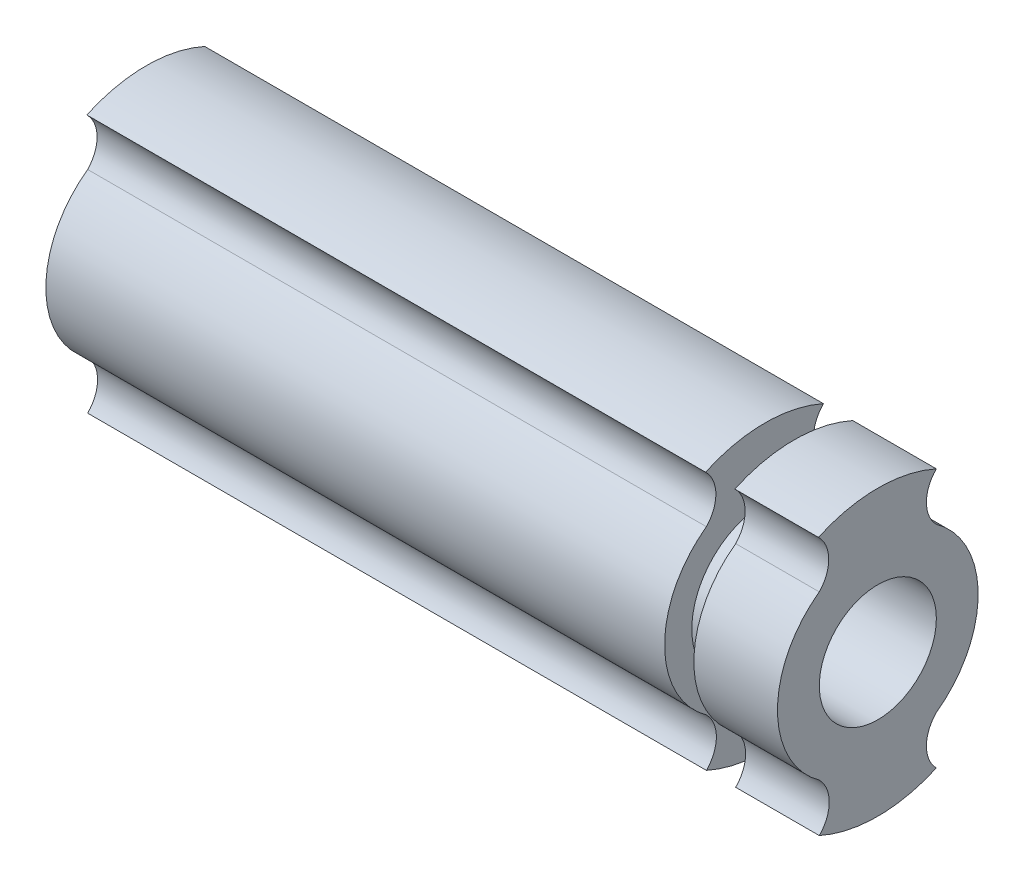
ISO-10303-21;
HEADER;
FILE_DESCRIPTION(('STEP AP214'),'2;1');
FILE_NAME('part.step','',(''),(''),'','','');
FILE_SCHEMA(('AUTOMOTIVE_DESIGN { 1 0 10303 214 1 1 1 1 }'));
ENDSEC;
DATA;
#1=APPLICATION_CONTEXT('core data for automotive mechanical design processes');
#2=APPLICATION_PROTOCOL_DEFINITION('international standard','automotive_design',2000,#1);
#3=PRODUCT_CONTEXT('',#1,'mechanical');
#4=PRODUCT('Part','Part','',(#3));
#5=PRODUCT_RELATED_PRODUCT_CATEGORY('part','',(#4));
#6=PRODUCT_DEFINITION_FORMATION('','',#4);
#7=PRODUCT_DEFINITION_CONTEXT('part definition',#1,'design');
#8=PRODUCT_DEFINITION('design','',#6,#7);
#9=PRODUCT_DEFINITION_SHAPE('','',#8);
#10=(LENGTH_UNIT() NAMED_UNIT(*) SI_UNIT(.MILLI.,.METRE.));
#11=(NAMED_UNIT(*) PLANE_ANGLE_UNIT() SI_UNIT($,.RADIAN.));
#12=(NAMED_UNIT(*) SI_UNIT($,.STERADIAN.) SOLID_ANGLE_UNIT());
#13=UNCERTAINTY_MEASURE_WITH_UNIT(LENGTH_MEASURE(1.E-05),#10,'distance_accuracy_value','');
#14=(GEOMETRIC_REPRESENTATION_CONTEXT(3) GLOBAL_UNCERTAINTY_ASSIGNED_CONTEXT((#13)) GLOBAL_UNIT_ASSIGNED_CONTEXT((#10,
#11,#12)) REPRESENTATION_CONTEXT('',''));
#15=CARTESIAN_POINT('',(0.,0.,0.));
#16=DIRECTION('',(0.,0.,1.));
#17=DIRECTION('',(1.,0.,0.));
#18=AXIS2_PLACEMENT_3D('',#15,#16,#17);
#19=CARTESIAN_POINT('',(175.,0.,0.));
#20=DIRECTION('',(-1.,0.,0.));
#21=DIRECTION('',(0.,0.,1.));
#22=AXIS2_PLACEMENT_3D('',#19,#20,#21);
#23=CYLINDRICAL_SURFACE('',#22,24.);
#24=DIRECTION('',(-1.,0.,0.));
#25=VECTOR('',#24,1.);
#26=CARTESIAN_POINT('',(175.,19.4935886896179,-14.));
#27=LINE('',#26,#25);
#28=CARTESIAN_POINT('',(148.,19.4935886896179,-14.));
#29=VERTEX_POINT('',#28);
#30=CARTESIAN_POINT('',(0.,19.4935886896179,-14.));
#31=VERTEX_POINT('',#30);
#32=EDGE_CURVE('E192',#29,#31,#27,.T.);
#33=ORIENTED_EDGE('',*,*,#32,.F.);
#34=CARTESIAN_POINT('',(148.,0.,0.));
#35=DIRECTION('',(-1.,0.,0.));
#36=DIRECTION('',(0.,0.,1.));
#37=AXIS2_PLACEMENT_3D('',#34,#35,#36);
#38=CIRCLE('',#37,24.);
#39=CARTESIAN_POINT('',(148.,-19.4935886896179,-14.));
#40=VERTEX_POINT('',#39);
#41=EDGE_CURVE('E289',#29,#40,#38,.T.);
#42=ORIENTED_EDGE('',*,*,#41,.T.);
#43=DIRECTION('',(-1.,0.,0.));
#44=VECTOR('',#43,1.);
#45=CARTESIAN_POINT('',(175.,-19.4935886896179,-14.));
#46=LINE('',#45,#44);
#47=CARTESIAN_POINT('',(0.,-19.4935886896179,-14.));
#48=VERTEX_POINT('',#47);
#49=EDGE_CURVE('E221',#40,#48,#46,.T.);
#50=ORIENTED_EDGE('',*,*,#49,.T.);
#51=CARTESIAN_POINT('',(0.,0.,0.));
#52=DIRECTION('',(1.,0.,0.));
#53=DIRECTION('',(0.,0.,-1.));
#54=AXIS2_PLACEMENT_3D('',#51,#52,#53);
#55=CIRCLE('',#54,24.);
#56=EDGE_CURVE('E217',#48,#31,#55,.T.);
#57=ORIENTED_EDGE('',*,*,#56,.T.);
#58=EDGE_LOOP('',(#33,#42,#50,#57));
#59=FACE_BOUND('',#58,.T.);
#60=ADVANCED_FACE('F39',(#59),#23,.T.);
#61=CARTESIAN_POINT('',(175.,25.2387277296386,-19.7451390400207));
#62=DIRECTION('',(-1.,0.,0.));
#63=DIRECTION('',(0.,0.,1.));
#64=AXIS2_PLACEMENT_3D('',#61,#62,#63);
#65=CYLINDRICAL_SURFACE('',#64,8.12485354811642);
#66=DIRECTION('',(-1.,0.,0.));
#67=VECTOR('',#66,1.);
#68=CARTESIAN_POINT('',(175.,30.9838667696593,-14.));
#69=LINE('',#68,#67);
#70=CARTESIAN_POINT('',(148.,30.9838667696593,-14.));
#71=VERTEX_POINT('',#70);
#72=CARTESIAN_POINT('',(0.,30.9838667696593,-14.));
#73=VERTEX_POINT('',#72);
#74=EDGE_CURVE('E194',#71,#73,#69,.T.);
#75=ORIENTED_EDGE('',*,*,#74,.F.);
#76=CARTESIAN_POINT('',(148.,25.2387277296386,-19.7451390400207));
#77=DIRECTION('',(-1.,0.,0.));
#78=DIRECTION('',(0.,0.,1.));
#79=AXIS2_PLACEMENT_3D('',#76,#77,#78);
#80=CIRCLE('',#79,8.12485354811642);
#81=EDGE_CURVE('E207',#71,#29,#80,.F.);
#82=ORIENTED_EDGE('',*,*,#81,.T.);
#83=ORIENTED_EDGE('',*,*,#32,.T.);
#84=CARTESIAN_POINT('',(0.,25.2387277296386,-19.7451390400207));
#85=DIRECTION('',(-1.,0.,0.));
#86=DIRECTION('',(0.,0.,1.));
#87=AXIS2_PLACEMENT_3D('',#84,#85,#86);
#88=CIRCLE('',#87,8.12485354811642);
#89=EDGE_CURVE('E210',#31,#73,#88,.T.);
#90=ORIENTED_EDGE('',*,*,#89,.T.);
#91=EDGE_LOOP('',(#75,#82,#83,#90));
#92=FACE_BOUND('',#91,.T.);
#93=ADVANCED_FACE('F206',(#92),#65,.F.);
#94=CARTESIAN_POINT('',(175.,0.,0.));
#95=DIRECTION('',(-1.,0.,0.));
#96=DIRECTION('',(0.,0.,1.));
#97=AXIS2_PLACEMENT_3D('',#94,#95,#96);
#98=CYLINDRICAL_SURFACE('',#97,34.);
#99=DIRECTION('',(-1.,0.,0.));
#100=VECTOR('',#99,1.);
#101=CARTESIAN_POINT('',(175.,30.8916689330158,14.2022811735632));
#102=LINE('',#101,#100);
#103=CARTESIAN_POINT('',(148.,30.8916689330158,14.2022811735632));
#104=VERTEX_POINT('',#103);
#105=CARTESIAN_POINT('',(0.,30.8916689330158,14.2022811735632));
#106=VERTEX_POINT('',#105);
#107=EDGE_CURVE('E186',#104,#106,#102,.T.);
#108=ORIENTED_EDGE('',*,*,#107,.F.);
#109=CARTESIAN_POINT('',(148.,0.,0.));
#110=DIRECTION('',(-1.,0.,0.));
#111=DIRECTION('',(0.,0.,1.));
#112=AXIS2_PLACEMENT_3D('',#109,#110,#111);
#113=CIRCLE('',#112,34.);
#114=EDGE_CURVE('E281',#104,#71,#113,.T.);
#115=ORIENTED_EDGE('',*,*,#114,.T.);
#116=ORIENTED_EDGE('',*,*,#74,.T.);
#117=CARTESIAN_POINT('',(0.,0.,0.));
#118=DIRECTION('',(1.,0.,0.));
#119=DIRECTION('',(0.,0.,-1.));
#120=AXIS2_PLACEMENT_3D('',#117,#118,#119);
#121=CIRCLE('',#120,34.);
#122=EDGE_CURVE('E222',#73,#106,#121,.T.);
#123=ORIENTED_EDGE('',*,*,#122,.T.);
#124=EDGE_LOOP('',(#108,#115,#116,#123));
#125=FACE_BOUND('',#124,.T.);
#126=ADVANCED_FACE('F310',(#125),#98,.T.);
#127=CARTESIAN_POINT('',(175.,25.0914882245353,19.8001807084806));
#128=DIRECTION('',(-1.,0.,0.));
#129=DIRECTION('',(0.,0.,1.));
#130=AXIS2_PLACEMENT_3D('',#127,#128,#129);
#131=CYLINDRICAL_SURFACE('',#130,8.0609289448585);
#132=DIRECTION('',(-1.,0.,0.));
#133=VECTOR('',#132,1.);
#134=CARTESIAN_POINT('',(175.,19.4935886896179,14.));
#135=LINE('',#134,#133);
#136=CARTESIAN_POINT('',(148.,19.4935886896179,14.));
#137=VERTEX_POINT('',#136);
#138=CARTESIAN_POINT('',(0.,19.4935886896179,14.));
#139=VERTEX_POINT('',#138);
#140=EDGE_CURVE('E181',#137,#139,#135,.T.);
#141=ORIENTED_EDGE('',*,*,#140,.F.);
#142=CARTESIAN_POINT('',(148.,25.0914882245353,19.8001807084806));
#143=DIRECTION('',(-1.,0.,0.));
#144=DIRECTION('',(0.,0.,1.));
#145=AXIS2_PLACEMENT_3D('',#142,#143,#144);
#146=CIRCLE('',#145,8.0609289448585);
#147=EDGE_CURVE('E276',#137,#104,#146,.F.);
#148=ORIENTED_EDGE('',*,*,#147,.T.);
#149=ORIENTED_EDGE('',*,*,#107,.T.);
#150=CARTESIAN_POINT('',(0.,25.0914882245353,19.8001807084806));
#151=DIRECTION('',(-1.,0.,0.));
#152=DIRECTION('',(0.,0.,-1.));
#153=AXIS2_PLACEMENT_3D('',#150,#151,#152);
#154=CIRCLE('',#153,8.0609289448585);
#155=EDGE_CURVE('E232',#106,#139,#154,.T.);
#156=ORIENTED_EDGE('',*,*,#155,.T.);
#157=EDGE_LOOP('',(#141,#148,#149,#156));
#158=FACE_BOUND('',#157,.T.);
#159=ADVANCED_FACE('F337',(#158),#131,.F.);
#160=CARTESIAN_POINT('',(175.,0.,0.));
#161=DIRECTION('',(-1.,0.,0.));
#162=DIRECTION('',(0.,0.,1.));
#163=AXIS2_PLACEMENT_3D('',#160,#161,#162);
#164=CYLINDRICAL_SURFACE('',#163,24.);
#165=DIRECTION('',(-1.,0.,0.));
#166=VECTOR('',#165,1.);
#167=CARTESIAN_POINT('',(175.,-19.4935886896179,14.));
#168=LINE('',#167,#166);
#169=CARTESIAN_POINT('',(148.,-19.4935886896179,14.));
#170=VERTEX_POINT('',#169);
#171=CARTESIAN_POINT('',(0.,-19.4935886896179,14.));
#172=VERTEX_POINT('',#171);
#173=EDGE_CURVE('E178',#170,#172,#168,.T.);
#174=ORIENTED_EDGE('',*,*,#173,.F.);
#175=CARTESIAN_POINT('',(148.,0.,0.));
#176=DIRECTION('',(-1.,0.,0.));
#177=DIRECTION('',(0.,0.,1.));
#178=AXIS2_PLACEMENT_3D('',#175,#176,#177);
#179=CIRCLE('',#178,24.);
#180=EDGE_CURVE('E277',#170,#137,#179,.T.);
#181=ORIENTED_EDGE('',*,*,#180,.T.);
#182=ORIENTED_EDGE('',*,*,#140,.T.);
#183=CARTESIAN_POINT('',(0.,0.,0.));
#184=DIRECTION('',(1.,0.,0.));
#185=DIRECTION('',(0.,0.,-1.));
#186=AXIS2_PLACEMENT_3D('',#183,#184,#185);
#187=CIRCLE('',#186,24.);
#188=EDGE_CURVE('E236',#139,#172,#187,.T.);
#189=ORIENTED_EDGE('',*,*,#188,.T.);
#190=EDGE_LOOP('',(#174,#181,#182,#189));
#191=FACE_BOUND('',#190,.T.);
#192=ADVANCED_FACE('F339',(#191),#164,.T.);
#193=CARTESIAN_POINT('',(175.,-25.2387277296386,19.7451390400207));
#194=DIRECTION('',(-1.,0.,0.));
#195=DIRECTION('',(0.,0.,1.));
#196=AXIS2_PLACEMENT_3D('',#193,#194,#195);
#197=CYLINDRICAL_SURFACE('',#196,8.12485354811643);
#198=DIRECTION('',(-1.,0.,0.));
#199=VECTOR('',#198,1.);
#200=CARTESIAN_POINT('',(175.,-30.9838667696593,14.));
#201=LINE('',#200,#199);
#202=CARTESIAN_POINT('',(148.,-30.9838667696593,14.));
#203=VERTEX_POINT('',#202);
#204=CARTESIAN_POINT('',(0.,-30.9838667696593,14.));
#205=VERTEX_POINT('',#204);
#206=EDGE_CURVE('E174',#203,#205,#201,.T.);
#207=ORIENTED_EDGE('',*,*,#206,.F.);
#208=CARTESIAN_POINT('',(148.,-25.2387277296386,19.7451390400207));
#209=DIRECTION('',(-1.,0.,0.));
#210=DIRECTION('',(0.,0.,1.));
#211=AXIS2_PLACEMENT_3D('',#208,#209,#210);
#212=CIRCLE('',#211,8.12485354811643);
#213=EDGE_CURVE('E268',#203,#170,#212,.F.);
#214=ORIENTED_EDGE('',*,*,#213,.T.);
#215=ORIENTED_EDGE('',*,*,#173,.T.);
#216=CARTESIAN_POINT('',(0.,-25.2387277296386,19.7451390400207));
#217=DIRECTION('',(-1.,0.,0.));
#218=DIRECTION('',(0.,0.,1.));
#219=AXIS2_PLACEMENT_3D('',#216,#217,#218);
#220=CIRCLE('',#219,8.12485354811643);
#221=EDGE_CURVE('E244',#172,#205,#220,.T.);
#222=ORIENTED_EDGE('',*,*,#221,.T.);
#223=EDGE_LOOP('',(#207,#214,#215,#222));
#224=FACE_BOUND('',#223,.T.);
#225=ADVANCED_FACE('F332',(#224),#197,.F.);
#226=CARTESIAN_POINT('',(175.,0.,0.));
#227=DIRECTION('',(-1.,0.,0.));
#228=DIRECTION('',(0.,0.,1.));
#229=AXIS2_PLACEMENT_3D('',#226,#227,#228);
#230=CYLINDRICAL_SURFACE('',#229,34.);
#231=DIRECTION('',(-1.,0.,0.));
#232=VECTOR('',#231,1.);
#233=CARTESIAN_POINT('',(175.,-30.9838667696593,-14.));
#234=LINE('',#233,#232);
#235=CARTESIAN_POINT('',(148.,-30.9838667696593,-14.));
#236=VERTEX_POINT('',#235);
#237=CARTESIAN_POINT('',(0.,-30.9838667696593,-14.));
#238=VERTEX_POINT('',#237);
#239=EDGE_CURVE('E171',#236,#238,#234,.T.);
#240=ORIENTED_EDGE('',*,*,#239,.F.);
#241=CARTESIAN_POINT('',(148.,0.,0.));
#242=DIRECTION('',(-1.,0.,0.));
#243=DIRECTION('',(0.,0.,1.));
#244=AXIS2_PLACEMENT_3D('',#241,#242,#243);
#245=CIRCLE('',#244,34.);
#246=EDGE_CURVE('E53',#236,#203,#245,.T.);
#247=ORIENTED_EDGE('',*,*,#246,.T.);
#248=ORIENTED_EDGE('',*,*,#206,.T.);
#249=CARTESIAN_POINT('',(0.,0.,0.));
#250=DIRECTION('',(1.,0.,0.));
#251=DIRECTION('',(0.,0.,-1.));
#252=AXIS2_PLACEMENT_3D('',#249,#250,#251);
#253=CIRCLE('',#252,34.);
#254=EDGE_CURVE('E243',#205,#238,#253,.T.);
#255=ORIENTED_EDGE('',*,*,#254,.T.);
#256=EDGE_LOOP('',(#240,#247,#248,#255));
#257=FACE_BOUND('',#256,.T.);
#258=ADVANCED_FACE('F326',(#257),#230,.T.);
#259=CARTESIAN_POINT('',(175.,-25.2387277296386,-19.7451390400207));
#260=DIRECTION('',(-1.,0.,0.));
#261=DIRECTION('',(0.,0.,1.));
#262=AXIS2_PLACEMENT_3D('',#259,#260,#261);
#263=CYLINDRICAL_SURFACE('',#262,8.12485354811642);
#264=ORIENTED_EDGE('',*,*,#49,.F.);
#265=CARTESIAN_POINT('',(148.,-25.2387277296386,-19.7451390400207));
#266=DIRECTION('',(-1.,0.,0.));
#267=DIRECTION('',(0.,0.,1.));
#268=AXIS2_PLACEMENT_3D('',#265,#266,#267);
#269=CIRCLE('',#268,8.12485354811642);
#270=EDGE_CURVE('E11',#40,#236,#269,.F.);
#271=ORIENTED_EDGE('',*,*,#270,.T.);
#272=ORIENTED_EDGE('',*,*,#239,.T.);
#273=CARTESIAN_POINT('',(0.,-25.2387277296386,-19.7451390400207));
#274=DIRECTION('',(-1.,0.,0.));
#275=DIRECTION('',(0.,0.,-1.));
#276=AXIS2_PLACEMENT_3D('',#273,#274,#275);
#277=CIRCLE('',#276,8.12485354811642);
#278=EDGE_CURVE('E249',#238,#48,#277,.T.);
#279=ORIENTED_EDGE('',*,*,#278,.T.);
#280=EDGE_LOOP('',(#264,#271,#272,#279));
#281=FACE_BOUND('',#280,.T.);
#282=ADVANCED_FACE('F303',(#281),#263,.F.);
#283=CARTESIAN_POINT('',(175.,12.6193638648193,-9.87256952001035));
#284=DIRECTION('',(1.,0.,0.));
#285=DIRECTION('',(0.,0.,-1.));
#286=AXIS2_PLACEMENT_3D('',#283,#284,#285);
#287=PLANE('',#286);
#288=CARTESIAN_POINT('',(175.,0.,0.));
#289=DIRECTION('',(1.,0.,0.));
#290=DIRECTION('',(0.,0.,-1.));
#291=AXIS2_PLACEMENT_3D('',#288,#289,#290);
#292=CIRCLE('',#291,24.);
#293=CARTESIAN_POINT('',(175.,-19.4935886896179,-14.));
#294=VERTEX_POINT('',#293);
#295=CARTESIAN_POINT('',(175.,19.4935886896179,-14.));
#296=VERTEX_POINT('',#295);
#297=EDGE_CURVE('E246',#294,#296,#292,.T.);
#298=ORIENTED_EDGE('',*,*,#297,.T.);
#299=CARTESIAN_POINT('',(175.,25.2387277296386,-19.7451390400207));
#300=DIRECTION('',(-1.,0.,0.));
#301=DIRECTION('',(0.,0.,1.));
#302=AXIS2_PLACEMENT_3D('',#299,#300,#301);
#303=CIRCLE('',#302,8.12485354811642);
#304=CARTESIAN_POINT('',(175.,30.9838667696593,-14.));
#305=VERTEX_POINT('',#304);
#306=EDGE_CURVE('E247',#296,#305,#303,.T.);
#307=ORIENTED_EDGE('',*,*,#306,.T.);
#308=CARTESIAN_POINT('',(175.,0.,0.));
#309=DIRECTION('',(1.,0.,0.));
#310=DIRECTION('',(0.,0.,-1.));
#311=AXIS2_PLACEMENT_3D('',#308,#309,#310);
#312=CIRCLE('',#311,34.);
#313=CARTESIAN_POINT('',(175.,30.8916689330158,14.2022811735632));
#314=VERTEX_POINT('',#313);
#315=EDGE_CURVE('E255',#305,#314,#312,.T.);
#316=ORIENTED_EDGE('',*,*,#315,.T.);
#317=CARTESIAN_POINT('',(175.,25.0914882245353,19.8001807084806));
#318=DIRECTION('',(-1.,0.,0.));
#319=DIRECTION('',(0.,0.,-1.));
#320=AXIS2_PLACEMENT_3D('',#317,#318,#319);
#321=CIRCLE('',#320,8.0609289448585);
#322=CARTESIAN_POINT('',(175.,19.4935886896179,14.));
#323=VERTEX_POINT('',#322);
#324=EDGE_CURVE('E259',#314,#323,#321,.T.);
#325=ORIENTED_EDGE('',*,*,#324,.T.);
#326=CARTESIAN_POINT('',(175.,0.,0.));
#327=DIRECTION('',(1.,0.,0.));
#328=DIRECTION('',(0.,0.,-1.));
#329=AXIS2_PLACEMENT_3D('',#326,#327,#328);
#330=CIRCLE('',#329,24.);
#331=CARTESIAN_POINT('',(175.,-19.4935886896179,14.));
#332=VERTEX_POINT('',#331);
#333=EDGE_CURVE('E261',#323,#332,#330,.T.);
#334=ORIENTED_EDGE('',*,*,#333,.T.);
#335=CARTESIAN_POINT('',(175.,-25.2387277296386,19.7451390400207));
#336=DIRECTION('',(-1.,0.,0.));
#337=DIRECTION('',(0.,0.,1.));
#338=AXIS2_PLACEMENT_3D('',#335,#336,#337);
#339=CIRCLE('',#338,8.12485354811643);
#340=CARTESIAN_POINT('',(175.,-30.9838667696593,14.));
#341=VERTEX_POINT('',#340);
#342=EDGE_CURVE('E263',#332,#341,#339,.T.);
#343=ORIENTED_EDGE('',*,*,#342,.T.);
#344=CARTESIAN_POINT('',(175.,0.,0.));
#345=DIRECTION('',(1.,0.,0.));
#346=DIRECTION('',(0.,0.,-1.));
#347=AXIS2_PLACEMENT_3D('',#344,#345,#346);
#348=CIRCLE('',#347,34.);
#349=CARTESIAN_POINT('',(175.,-30.9838667696593,-14.));
#350=VERTEX_POINT('',#349);
#351=EDGE_CURVE('E262',#341,#350,#348,.T.);
#352=ORIENTED_EDGE('',*,*,#351,.T.);
#353=CARTESIAN_POINT('',(175.,-25.2387277296386,-19.7451390400207));
#354=DIRECTION('',(-1.,0.,0.));
#355=DIRECTION('',(0.,0.,-1.));
#356=AXIS2_PLACEMENT_3D('',#353,#354,#355);
#357=CIRCLE('',#356,8.12485354811642);
#358=EDGE_CURVE('E168',#350,#294,#357,.T.);
#359=ORIENTED_EDGE('',*,*,#358,.T.);
#360=EDGE_LOOP('',(#298,#307,#316,#325,#334,#343,#352,#359));
#361=FACE_BOUND('',#360,.T.);
#362=CARTESIAN_POINT('',(175.,0.,0.));
#363=DIRECTION('',(1.,0.,0.));
#364=DIRECTION('',(0.,0.,-1.));
#365=AXIS2_PLACEMENT_3D('',#362,#363,#364);
#366=CIRCLE('',#365,14.);
#367=CARTESIAN_POINT('',(175.,0.,-14.));
#368=VERTEX_POINT('',#367);
#369=EDGE_CURVE('E229',#368,#368,#366,.T.);
#370=ORIENTED_EDGE('',*,*,#369,.F.);
#371=EDGE_LOOP('',(#370));
#372=FACE_BOUND('',#371,.T.);
#373=ADVANCED_FACE('F320',(#361,#372),#287,.T.);
#374=CARTESIAN_POINT('',(0.,12.6193638648193,-9.87256952001035));
#375=DIRECTION('',(1.,0.,0.));
#376=DIRECTION('',(0.,0.,-1.));
#377=AXIS2_PLACEMENT_3D('',#374,#375,#376);
#378=PLANE('',#377);
#379=ORIENTED_EDGE('',*,*,#56,.F.);
#380=ORIENTED_EDGE('',*,*,#278,.F.);
#381=ORIENTED_EDGE('',*,*,#254,.F.);
#382=ORIENTED_EDGE('',*,*,#221,.F.);
#383=ORIENTED_EDGE('',*,*,#188,.F.);
#384=ORIENTED_EDGE('',*,*,#155,.F.);
#385=ORIENTED_EDGE('',*,*,#122,.F.);
#386=ORIENTED_EDGE('',*,*,#89,.F.);
#387=EDGE_LOOP('',(#379,#380,#381,#382,#383,#384,#385,#386));
#388=FACE_BOUND('',#387,.T.);
#389=CARTESIAN_POINT('',(0.,0.,0.));
#390=DIRECTION('',(1.,0.,0.));
#391=DIRECTION('',(0.,0.,-1.));
#392=AXIS2_PLACEMENT_3D('',#389,#390,#391);
#393=CIRCLE('',#392,14.);
#394=CARTESIAN_POINT('',(0.,0.,-14.));
#395=VERTEX_POINT('',#394);
#396=EDGE_CURVE('E228',#395,#395,#393,.T.);
#397=ORIENTED_EDGE('',*,*,#396,.T.);
#398=EDGE_LOOP('',(#397));
#399=FACE_BOUND('',#398,.T.);
#400=ADVANCED_FACE('F214',(#388,#399),#378,.F.);
#401=CARTESIAN_POINT('',(155.,-19.4935886896179,-14.));
#402=VERTEX_POINT('',#401);
#403=EDGE_CURVE('E172',#294,#402,#46,.T.);
#404=ORIENTED_EDGE('',*,*,#403,.T.);
#405=CARTESIAN_POINT('',(155.,0.,0.));
#406=DIRECTION('',(1.,0.,0.));
#407=DIRECTION('',(0.,0.,-1.));
#408=AXIS2_PLACEMENT_3D('',#405,#406,#407);
#409=CIRCLE('',#408,24.);
#410=CARTESIAN_POINT('',(155.,19.4935886896179,-14.));
#411=VERTEX_POINT('',#410);
#412=EDGE_CURVE('E64',#402,#411,#409,.T.);
#413=ORIENTED_EDGE('',*,*,#412,.T.);
#414=EDGE_CURVE('E156',#296,#411,#27,.T.);
#415=ORIENTED_EDGE('',*,*,#414,.F.);
#416=ORIENTED_EDGE('',*,*,#297,.F.);
#417=EDGE_LOOP('',(#404,#413,#415,#416));
#418=FACE_BOUND('',#417,.T.);
#419=ADVANCED_FACE('F41',(#418),#23,.T.);
#420=ORIENTED_EDGE('',*,*,#414,.T.);
#421=CARTESIAN_POINT('',(155.,25.2387277296386,-19.7451390400207));
#422=DIRECTION('',(1.,0.,0.));
#423=DIRECTION('',(0.,0.,-1.));
#424=AXIS2_PLACEMENT_3D('',#421,#422,#423);
#425=CIRCLE('',#424,8.12485354811642);
#426=CARTESIAN_POINT('',(155.,30.9838667696593,-14.));
#427=VERTEX_POINT('',#426);
#428=EDGE_CURVE('E266',#411,#427,#425,.F.);
#429=ORIENTED_EDGE('',*,*,#428,.T.);
#430=EDGE_CURVE('E191',#305,#427,#69,.T.);
#431=ORIENTED_EDGE('',*,*,#430,.F.);
#432=ORIENTED_EDGE('',*,*,#306,.F.);
#433=EDGE_LOOP('',(#420,#429,#431,#432));
#434=FACE_BOUND('',#433,.T.);
#435=ADVANCED_FACE('F309',(#434),#65,.F.);
#436=ORIENTED_EDGE('',*,*,#430,.T.);
#437=CARTESIAN_POINT('',(155.,0.,0.));
#438=DIRECTION('',(1.,0.,0.));
#439=DIRECTION('',(0.,0.,-1.));
#440=AXIS2_PLACEMENT_3D('',#437,#438,#439);
#441=CIRCLE('',#440,34.);
#442=CARTESIAN_POINT('',(155.,30.8916689330158,14.2022811735632));
#443=VERTEX_POINT('',#442);
#444=EDGE_CURVE('E269',#427,#443,#441,.T.);
#445=ORIENTED_EDGE('',*,*,#444,.T.);
#446=EDGE_CURVE('E190',#314,#443,#102,.T.);
#447=ORIENTED_EDGE('',*,*,#446,.F.);
#448=ORIENTED_EDGE('',*,*,#315,.F.);
#449=EDGE_LOOP('',(#436,#445,#447,#448));
#450=FACE_BOUND('',#449,.T.);
#451=ADVANCED_FACE('F316',(#450),#98,.T.);
#452=ORIENTED_EDGE('',*,*,#446,.T.);
#453=CARTESIAN_POINT('',(155.,25.0914882245353,19.8001807084806));
#454=DIRECTION('',(1.,0.,0.));
#455=DIRECTION('',(0.,0.,-1.));
#456=AXIS2_PLACEMENT_3D('',#453,#454,#455);
#457=CIRCLE('',#456,8.0609289448585);
#458=CARTESIAN_POINT('',(155.,19.4935886896179,14.));
#459=VERTEX_POINT('',#458);
#460=EDGE_CURVE('E502',#443,#459,#457,.F.);
#461=ORIENTED_EDGE('',*,*,#460,.T.);
#462=EDGE_CURVE('E184',#323,#459,#135,.T.);
#463=ORIENTED_EDGE('',*,*,#462,.F.);
#464=ORIENTED_EDGE('',*,*,#324,.F.);
#465=EDGE_LOOP('',(#452,#461,#463,#464));
#466=FACE_BOUND('',#465,.T.);
#467=ADVANCED_FACE('F331',(#466),#131,.F.);
#468=ORIENTED_EDGE('',*,*,#462,.T.);
#469=CARTESIAN_POINT('',(155.,0.,0.));
#470=DIRECTION('',(1.,0.,0.));
#471=DIRECTION('',(0.,0.,-1.));
#472=AXIS2_PLACEMENT_3D('',#469,#470,#471);
#473=CIRCLE('',#472,24.);
#474=CARTESIAN_POINT('',(155.,-19.4935886896179,14.));
#475=VERTEX_POINT('',#474);
#476=EDGE_CURVE('E501',#459,#475,#473,.T.);
#477=ORIENTED_EDGE('',*,*,#476,.T.);
#478=EDGE_CURVE('E177',#332,#475,#168,.T.);
#479=ORIENTED_EDGE('',*,*,#478,.F.);
#480=ORIENTED_EDGE('',*,*,#333,.F.);
#481=EDGE_LOOP('',(#468,#477,#479,#480));
#482=FACE_BOUND('',#481,.T.);
#483=ADVANCED_FACE('F328',(#482),#164,.T.);
#484=ORIENTED_EDGE('',*,*,#478,.T.);
#485=CARTESIAN_POINT('',(155.,-25.2387277296386,19.7451390400207));
#486=DIRECTION('',(1.,0.,0.));
#487=DIRECTION('',(0.,0.,-1.));
#488=AXIS2_PLACEMENT_3D('',#485,#486,#487);
#489=CIRCLE('',#488,8.12485354811643);
#490=CARTESIAN_POINT('',(155.,-30.9838667696593,14.));
#491=VERTEX_POINT('',#490);
#492=EDGE_CURVE('E167',#475,#491,#489,.F.);
#493=ORIENTED_EDGE('',*,*,#492,.T.);
#494=EDGE_CURVE('E164',#341,#491,#201,.T.);
#495=ORIENTED_EDGE('',*,*,#494,.F.);
#496=ORIENTED_EDGE('',*,*,#342,.F.);
#497=EDGE_LOOP('',(#484,#493,#495,#496));
#498=FACE_BOUND('',#497,.T.);
#499=ADVANCED_FACE('F324',(#498),#197,.F.);
#500=ORIENTED_EDGE('',*,*,#494,.T.);
#501=CARTESIAN_POINT('',(155.,0.,0.));
#502=DIRECTION('',(1.,0.,0.));
#503=DIRECTION('',(0.,0.,-1.));
#504=AXIS2_PLACEMENT_3D('',#501,#502,#503);
#505=CIRCLE('',#504,34.);
#506=CARTESIAN_POINT('',(155.,-30.9838667696593,-14.));
#507=VERTEX_POINT('',#506);
#508=EDGE_CURVE('E147',#491,#507,#505,.T.);
#509=ORIENTED_EDGE('',*,*,#508,.T.);
#510=EDGE_CURVE('E165',#350,#507,#234,.T.);
#511=ORIENTED_EDGE('',*,*,#510,.F.);
#512=ORIENTED_EDGE('',*,*,#351,.F.);
#513=EDGE_LOOP('',(#500,#509,#511,#512));
#514=FACE_BOUND('',#513,.T.);
#515=ADVANCED_FACE('F159',(#514),#230,.T.);
#516=ORIENTED_EDGE('',*,*,#510,.T.);
#517=CARTESIAN_POINT('',(155.,-25.2387277296386,-19.7451390400207));
#518=DIRECTION('',(1.,0.,0.));
#519=DIRECTION('',(0.,0.,-1.));
#520=AXIS2_PLACEMENT_3D('',#517,#518,#519);
#521=CIRCLE('',#520,8.12485354811642);
#522=EDGE_CURVE('E50',#507,#402,#521,.F.);
#523=ORIENTED_EDGE('',*,*,#522,.T.);
#524=ORIENTED_EDGE('',*,*,#403,.F.);
#525=ORIENTED_EDGE('',*,*,#358,.F.);
#526=EDGE_LOOP('',(#516,#523,#524,#525));
#527=FACE_BOUND('',#526,.T.);
#528=ADVANCED_FACE('F166',(#527),#263,.F.);
#529=CARTESIAN_POINT('',(175.,0.,0.));
#530=DIRECTION('',(-1.,0.,0.));
#531=DIRECTION('',(0.,0.,1.));
#532=AXIS2_PLACEMENT_3D('',#529,#530,#531);
#533=CYLINDRICAL_SURFACE('',#532,14.);
#534=ORIENTED_EDGE('',*,*,#369,.T.);
#535=EDGE_LOOP('',(#534));
#536=FACE_BOUND('',#535,.T.);
#537=ORIENTED_EDGE('',*,*,#396,.F.);
#538=EDGE_LOOP('',(#537));
#539=FACE_BOUND('',#538,.T.);
#540=ADVANCED_FACE('F287',(#536,#539),#533,.F.);
#541=CARTESIAN_POINT('',(148.,41.3803263091357,0.));
#542=DIRECTION('',(-1.,0.,0.));
#543=DIRECTION('',(0.,0.,1.));
#544=AXIS2_PLACEMENT_3D('',#541,#542,#543);
#545=PLANE('',#544);
#546=CARTESIAN_POINT('',(148.,0.,0.));
#547=DIRECTION('',(1.,0.,0.));
#548=DIRECTION('',(0.,0.,-1.));
#549=AXIS2_PLACEMENT_3D('',#546,#547,#548);
#550=CIRCLE('',#549,17.5);
#551=CARTESIAN_POINT('',(148.,0.,-17.5));
#552=VERTEX_POINT('',#551);
#553=EDGE_CURVE('E170',#552,#552,#550,.T.);
#554=ORIENTED_EDGE('',*,*,#553,.F.);
#555=EDGE_LOOP('',(#554));
#556=FACE_BOUND('',#555,.T.);
#557=ORIENTED_EDGE('',*,*,#81,.F.);
#558=ORIENTED_EDGE('',*,*,#114,.F.);
#559=ORIENTED_EDGE('',*,*,#147,.F.);
#560=ORIENTED_EDGE('',*,*,#180,.F.);
#561=ORIENTED_EDGE('',*,*,#213,.F.);
#562=ORIENTED_EDGE('',*,*,#246,.F.);
#563=ORIENTED_EDGE('',*,*,#270,.F.);
#564=ORIENTED_EDGE('',*,*,#41,.F.);
#565=EDGE_LOOP('',(#557,#558,#559,#560,#561,#562,#563,#564));
#566=FACE_BOUND('',#565,.T.);
#567=ADVANCED_FACE('F295',(#556,#566),#545,.F.);
#568=CARTESIAN_POINT('',(155.,41.3803263091357,0.));
#569=DIRECTION('',(1.,0.,0.));
#570=DIRECTION('',(0.,0.,-1.));
#571=AXIS2_PLACEMENT_3D('',#568,#569,#570);
#572=PLANE('',#571);
#573=CARTESIAN_POINT('',(155.,0.,0.));
#574=DIRECTION('',(1.,0.,0.));
#575=DIRECTION('',(0.,0.,-1.));
#576=AXIS2_PLACEMENT_3D('',#573,#574,#575);
#577=CIRCLE('',#576,17.5);
#578=CARTESIAN_POINT('',(155.,0.,-17.5));
#579=VERTEX_POINT('',#578);
#580=EDGE_CURVE('E494',#579,#579,#577,.T.);
#581=ORIENTED_EDGE('',*,*,#580,.T.);
#582=EDGE_LOOP('',(#581));
#583=FACE_BOUND('',#582,.T.);
#584=ORIENTED_EDGE('',*,*,#522,.F.);
#585=ORIENTED_EDGE('',*,*,#508,.F.);
#586=ORIENTED_EDGE('',*,*,#492,.F.);
#587=ORIENTED_EDGE('',*,*,#476,.F.);
#588=ORIENTED_EDGE('',*,*,#460,.F.);
#589=ORIENTED_EDGE('',*,*,#444,.F.);
#590=ORIENTED_EDGE('',*,*,#428,.F.);
#591=ORIENTED_EDGE('',*,*,#412,.F.);
#592=EDGE_LOOP('',(#584,#585,#586,#587,#588,#589,#590,#591));
#593=FACE_BOUND('',#592,.T.);
#594=ADVANCED_FACE('F149',(#583,#593),#572,.F.);
#595=CARTESIAN_POINT('',(175.,0.,0.));
#596=DIRECTION('',(1.,0.,0.));
#597=DIRECTION('',(0.,0.,-1.));
#598=AXIS2_PLACEMENT_3D('',#595,#596,#597);
#599=CYLINDRICAL_SURFACE('',#598,17.5);
#600=ORIENTED_EDGE('',*,*,#580,.F.);
#601=EDGE_LOOP('',(#600));
#602=FACE_BOUND('',#601,.T.);
#603=ORIENTED_EDGE('',*,*,#553,.T.);
#604=EDGE_LOOP('',(#603));
#605=FACE_BOUND('',#604,.T.);
#606=ADVANCED_FACE('F403',(#602,#605),#599,.T.);
#607=CLOSED_SHELL('',(#60,#93,#126,#159,#192,#225,#258,#282,#373,#400,#419,#435,#451,#467,#483,
#499,#515,#528,#540,#567,#594,#606));
#608=MANIFOLD_SOLID_BREP('B2',#607);
#609=ADVANCED_BREP_SHAPE_REPRESENTATION('',(#18,#608),#14);
#610=SHAPE_DEFINITION_REPRESENTATION(#9,#609);
ENDSEC;
END-ISO-10303-21;
